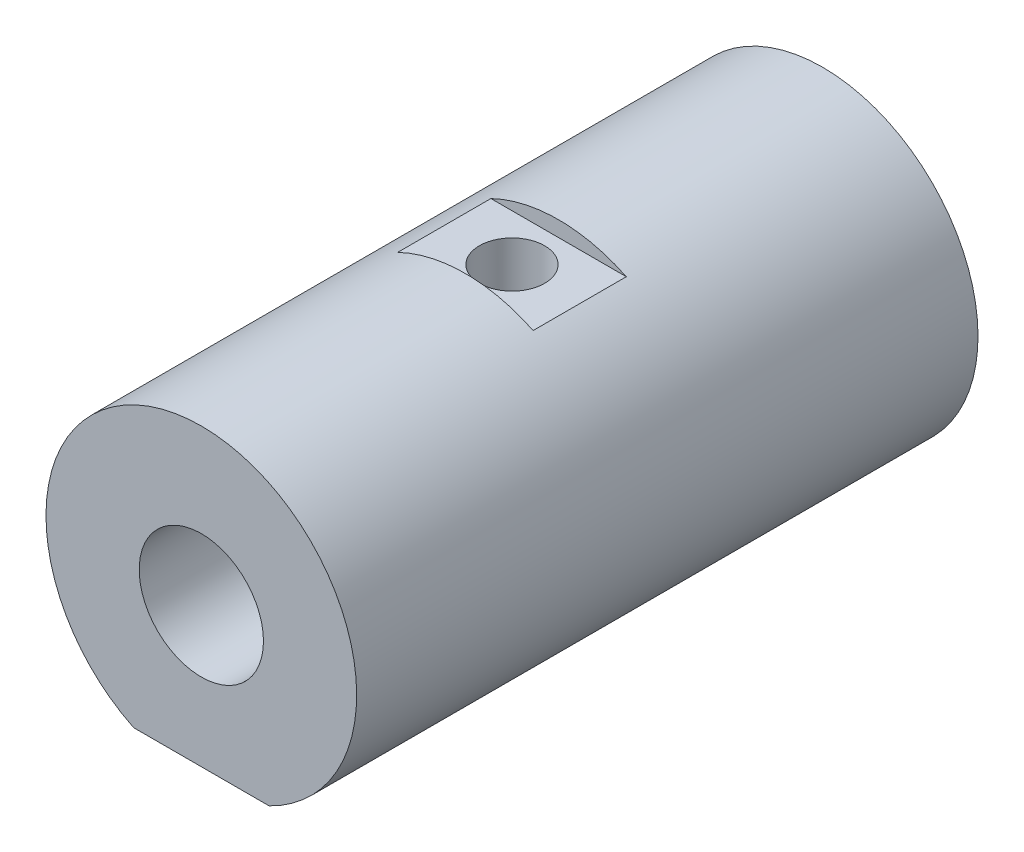
ISO-10303-21;
HEADER;
FILE_DESCRIPTION(('STEP AP214'),'2;1');
FILE_NAME('part.step','',(''),(''),'','','');
FILE_SCHEMA(('AUTOMOTIVE_DESIGN { 1 0 10303 214 1 1 1 1 }'));
ENDSEC;
DATA;
#1=APPLICATION_CONTEXT('core data for automotive mechanical design processes');
#2=APPLICATION_PROTOCOL_DEFINITION('international standard','automotive_design',2000,#1);
#3=PRODUCT_CONTEXT('',#1,'mechanical');
#4=PRODUCT('Part','Part','',(#3));
#5=PRODUCT_RELATED_PRODUCT_CATEGORY('part','',(#4));
#6=PRODUCT_DEFINITION_FORMATION('','',#4);
#7=PRODUCT_DEFINITION_CONTEXT('part definition',#1,'design');
#8=PRODUCT_DEFINITION('design','',#6,#7);
#9=PRODUCT_DEFINITION_SHAPE('','',#8);
#10=(LENGTH_UNIT() NAMED_UNIT(*) SI_UNIT(.MILLI.,.METRE.));
#11=(NAMED_UNIT(*) PLANE_ANGLE_UNIT() SI_UNIT($,.RADIAN.));
#12=(NAMED_UNIT(*) SI_UNIT($,.STERADIAN.) SOLID_ANGLE_UNIT());
#13=UNCERTAINTY_MEASURE_WITH_UNIT(LENGTH_MEASURE(1.E-05),#10,'distance_accuracy_value','');
#14=(GEOMETRIC_REPRESENTATION_CONTEXT(3) GLOBAL_UNCERTAINTY_ASSIGNED_CONTEXT((#13)) GLOBAL_UNIT_ASSIGNED_CONTEXT((#10,
#11,#12)) REPRESENTATION_CONTEXT('',''));
#15=CARTESIAN_POINT('',(0.,0.,0.));
#16=DIRECTION('',(0.,0.,1.));
#17=DIRECTION('',(1.,0.,0.));
#18=AXIS2_PLACEMENT_3D('',#15,#16,#17);
#19=CARTESIAN_POINT('',(0.,0.,40.));
#20=DIRECTION('',(0.,0.,1.));
#21=DIRECTION('',(1.,0.,0.));
#22=AXIS2_PLACEMENT_3D('',#19,#20,#21);
#23=PLANE('',#22);
#24=DIRECTION('',(1.,0.,0.));
#25=VECTOR('',#24,1.);
#26=CARTESIAN_POINT('',(-10.,-9.,40.));
#27=LINE('',#26,#25);
#28=CARTESIAN_POINT('',(-4.35889894354067,-9.,40.));
#29=VERTEX_POINT('',#28);
#30=CARTESIAN_POINT('',(4.35889894354067,-9.,40.));
#31=VERTEX_POINT('',#30);
#32=EDGE_CURVE('E49',#29,#31,#27,.T.);
#33=ORIENTED_EDGE('',*,*,#32,.T.);
#34=CARTESIAN_POINT('',(0.,0.,40.));
#35=DIRECTION('',(0.,0.,1.));
#36=DIRECTION('',(1.,0.,0.));
#37=AXIS2_PLACEMENT_3D('',#34,#35,#36);
#38=CIRCLE('',#37,10.);
#39=EDGE_CURVE('E87',#31,#29,#38,.T.);
#40=ORIENTED_EDGE('',*,*,#39,.T.);
#41=EDGE_LOOP('',(#33,#40));
#42=FACE_BOUND('',#41,.T.);
#43=CARTESIAN_POINT('',(0.,0.,40.));
#44=DIRECTION('',(0.,0.,1.));
#45=DIRECTION('',(1.,0.,0.));
#46=AXIS2_PLACEMENT_3D('',#43,#44,#45);
#47=CIRCLE('',#46,4.);
#48=CARTESIAN_POINT('',(4.,0.,40.));
#49=VERTEX_POINT('',#48);
#50=EDGE_CURVE('E93',#49,#49,#47,.T.);
#51=ORIENTED_EDGE('',*,*,#50,.F.);
#52=EDGE_LOOP('',(#51));
#53=FACE_BOUND('',#52,.T.);
#54=ADVANCED_FACE('F33',(#42,#53),#23,.T.);
#55=CARTESIAN_POINT('',(0.,0.,0.));
#56=DIRECTION('',(0.,0.,1.));
#57=DIRECTION('',(1.,0.,0.));
#58=AXIS2_PLACEMENT_3D('',#55,#56,#57);
#59=PLANE('',#58);
#60=CARTESIAN_POINT('',(0.,0.,0.));
#61=DIRECTION('',(0.,0.,1.));
#62=DIRECTION('',(1.,0.,0.));
#63=AXIS2_PLACEMENT_3D('',#60,#61,#62);
#64=CIRCLE('',#63,10.);
#65=CARTESIAN_POINT('',(4.35889894354067,-9.,0.));
#66=VERTEX_POINT('',#65);
#67=CARTESIAN_POINT('',(-4.35889894354067,-9.,0.));
#68=VERTEX_POINT('',#67);
#69=EDGE_CURVE('E89',#66,#68,#64,.T.);
#70=ORIENTED_EDGE('',*,*,#69,.F.);
#71=DIRECTION('',(-1.,0.,0.));
#72=VECTOR('',#71,1.);
#73=CARTESIAN_POINT('',(10.,-9.,0.));
#74=LINE('',#73,#72);
#75=EDGE_CURVE('E76',#66,#68,#74,.T.);
#76=ORIENTED_EDGE('',*,*,#75,.T.);
#77=EDGE_LOOP('',(#70,#76));
#78=FACE_BOUND('',#77,.T.);
#79=CARTESIAN_POINT('',(0.,0.,0.));
#80=DIRECTION('',(0.,0.,1.));
#81=DIRECTION('',(1.,0.,0.));
#82=AXIS2_PLACEMENT_3D('',#79,#80,#81);
#83=CIRCLE('',#82,4.);
#84=CARTESIAN_POINT('',(4.,0.,0.));
#85=VERTEX_POINT('',#84);
#86=EDGE_CURVE('E96',#85,#85,#83,.T.);
#87=ORIENTED_EDGE('',*,*,#86,.T.);
#88=EDGE_LOOP('',(#87));
#89=FACE_BOUND('',#88,.T.);
#90=ADVANCED_FACE('F179',(#78,#89),#59,.F.);
#91=CARTESIAN_POINT('',(0.,0.,40.));
#92=DIRECTION('',(0.,0.,-1.));
#93=DIRECTION('',(-1.,0.,0.));
#94=AXIS2_PLACEMENT_3D('',#91,#92,#93);
#95=CYLINDRICAL_SURFACE('',#94,10.);
#96=CARTESIAN_POINT('',(0.,0.,23.));
#97=DIRECTION('',(0.,0.,1.));
#98=DIRECTION('',(1.,0.,0.));
#99=AXIS2_PLACEMENT_3D('',#96,#97,#98);
#100=CIRCLE('',#99,10.);
#101=CARTESIAN_POINT('',(4.35889894354067,9.,23.));
#102=VERTEX_POINT('',#101);
#103=CARTESIAN_POINT('',(-4.35889894354067,9.,23.));
#104=VERTEX_POINT('',#103);
#105=EDGE_CURVE('E11',#102,#104,#100,.T.);
#106=ORIENTED_EDGE('',*,*,#105,.T.);
#107=DIRECTION('',(0.,0.,-1.));
#108=VECTOR('',#107,1.);
#109=CARTESIAN_POINT('',(-4.35889894354067,9.,40.));
#110=LINE('',#109,#108);
#111=CARTESIAN_POINT('',(-4.35889894354067,9.,17.));
#112=VERTEX_POINT('',#111);
#113=EDGE_CURVE('E105',#104,#112,#110,.T.);
#114=ORIENTED_EDGE('',*,*,#113,.T.);
#115=CARTESIAN_POINT('',(0.,0.,17.));
#116=DIRECTION('',(0.,0.,-1.));
#117=DIRECTION('',(-1.,0.,0.));
#118=AXIS2_PLACEMENT_3D('',#115,#116,#117);
#119=CIRCLE('',#118,10.);
#120=CARTESIAN_POINT('',(4.35889894354067,9.,17.));
#121=VERTEX_POINT('',#120);
#122=EDGE_CURVE('E42',#112,#121,#119,.T.);
#123=ORIENTED_EDGE('',*,*,#122,.T.);
#124=DIRECTION('',(0.,0.,-1.));
#125=VECTOR('',#124,1.);
#126=CARTESIAN_POINT('',(4.35889894354067,9.,40.));
#127=LINE('',#126,#125);
#128=EDGE_CURVE('E101',#121,#102,#127,.F.);
#129=ORIENTED_EDGE('',*,*,#128,.T.);
#130=EDGE_LOOP('',(#106,#114,#123,#129));
#131=FACE_BOUND('',#130,.T.);
#132=ORIENTED_EDGE('',*,*,#39,.F.);
#133=DIRECTION('',(0.,0.,-1.));
#134=VECTOR('',#133,1.);
#135=CARTESIAN_POINT('',(4.35889894354067,-9.,40.));
#136=LINE('',#135,#134);
#137=EDGE_CURVE('E73',#31,#66,#136,.T.);
#138=ORIENTED_EDGE('',*,*,#137,.T.);
#139=ORIENTED_EDGE('',*,*,#69,.T.);
#140=DIRECTION('',(0.,0.,-1.));
#141=VECTOR('',#140,1.);
#142=CARTESIAN_POINT('',(-4.35889894354067,-9.,40.));
#143=LINE('',#142,#141);
#144=EDGE_CURVE('E82',#68,#29,#143,.F.);
#145=ORIENTED_EDGE('',*,*,#144,.T.);
#146=EDGE_LOOP('',(#132,#138,#139,#145));
#147=FACE_BOUND('',#146,.T.);
#148=ADVANCED_FACE('F35',(#131,#147),#95,.T.);
#149=CARTESIAN_POINT('',(0.,0.,40.));
#150=DIRECTION('',(0.,0.,-1.));
#151=DIRECTION('',(-1.,0.,0.));
#152=AXIS2_PLACEMENT_3D('',#149,#150,#151);
#153=CYLINDRICAL_SURFACE('',#152,4.);
#154=CARTESIAN_POINT('',(0.,-4.,22.1));
#155=CARTESIAN_POINT('',(0.109725239522176,-3.99999264287857,22.099991491824));
#156=CARTESIAN_POINT('',(0.219566121797986,-3.99543735627817,22.0913492221785));
#157=CARTESIAN_POINT('',(0.435956332853303,-3.97766056559727,22.0571794851637));
#158=CARTESIAN_POINT('',(0.54249996702617,-3.96442485872988,22.0316243445559));
#159=CARTESIAN_POINT('',(0.748847767256637,-3.93066356262107,21.96492682042));
#160=CARTESIAN_POINT('',(0.84867708849202,-3.91016722161181,21.9238469319648));
#161=CARTESIAN_POINT('',(1.0398542926017,-3.86372814833453,21.82761268027));
#162=CARTESIAN_POINT('',(1.13120230734359,-3.83778550076629,21.7724585359073));
#163=CARTESIAN_POINT('',(1.30947182891695,-3.78081963010103,21.64560480379));
#164=CARTESIAN_POINT('',(1.39572427915895,-3.7495762633363,21.5730654494358));
#165=CARTESIAN_POINT('',(1.55546505007128,-3.68618069665244,21.4153256839063));
#166=CARTESIAN_POINT('',(1.62894256542358,-3.65402775386038,21.3301146666852));
#167=CARTESIAN_POINT('',(1.76753210720387,-3.58917602274785,21.1405241641815));
#168=CARTESIAN_POINT('',(1.83134596949796,-3.55667651133238,21.0351191113742));
#169=CARTESIAN_POINT('',(1.94007800952201,-3.49855992208216,20.8132210125949));
#170=CARTESIAN_POINT('',(1.98501055983617,-3.47293761465965,20.6967364835342));
#171=CARTESIAN_POINT('',(2.05162778973323,-3.43398312295476,20.4632691019904));
#172=CARTESIAN_POINT('',(2.07458133375183,-3.41998733122417,20.346765095698));
#173=CARTESIAN_POINT('',(2.1004206577409,-3.40418721984817,20.1107919613446));
#174=CARTESIAN_POINT('',(2.10333025607272,-3.40236843025801,19.9913265219365));
#175=CARTESIAN_POINT('',(2.08992575686748,-3.41060563138389,19.770235859006));
#176=CARTESIAN_POINT('',(2.07615752002026,-3.4190893964975,19.6683823531537));
#177=CARTESIAN_POINT('',(2.03424482005422,-3.44418916575293,19.4687198513604));
#178=CARTESIAN_POINT('',(2.00609491145432,-3.460808250155,19.3709124025946));
#179=CARTESIAN_POINT('',(1.93576201725035,-3.50064017337879,19.1793394413355));
#180=CARTESIAN_POINT('',(1.89327386515966,-3.52399463994301,19.0857168263886));
#181=CARTESIAN_POINT('',(1.79571666755297,-3.57469177714186,18.9064612544599));
#182=CARTESIAN_POINT('',(1.74064200304353,-3.60203622704668,18.820831890023));
#183=CARTESIAN_POINT('',(1.61039398180522,-3.66230444404028,18.6472195775902));
#184=CARTESIAN_POINT('',(1.53347842501707,-3.69546972830905,18.5606227305343));
#185=CARTESIAN_POINT('',(1.36616462781175,-3.76053926987168,18.4009450794933));
#186=CARTESIAN_POINT('',(1.27575868558247,-3.79244279356363,18.3278720501457));
#187=CARTESIAN_POINT('',(1.07766804032998,-3.85356353260701,18.1934178793153));
#188=CARTESIAN_POINT('',(0.9692989194435,-3.88252998474475,18.1329215311883));
#189=CARTESIAN_POINT('',(0.742023442184863,-3.93228772595726,18.031537329285));
#190=CARTESIAN_POINT('',(0.623126340783868,-3.95308610970455,17.9906324518135));
#191=CARTESIAN_POINT('',(0.38939697462669,-3.9825873442618,17.9332273208939));
#192=CARTESIAN_POINT('',(0.275130823094224,-3.99219507728301,17.9148930907168));
#193=CARTESIAN_POINT('',(0.0447608666750931,-4.00140669767392,17.8973068509909));
#194=CARTESIAN_POINT('',(-0.0713418920739016,-4.00101608864393,17.8980443433899));
#195=CARTESIAN_POINT('',(-0.291279078552977,-3.99076728683619,17.9176272578829));
#196=CARTESIAN_POINT('',(-0.395299675486035,-3.98173859499713,17.9348862295497));
#197=CARTESIAN_POINT('',(-0.59872818219623,-3.95626547527309,17.9844387504391));
#198=CARTESIAN_POINT('',(-0.69813560404272,-3.93982026491349,18.0167338860534));
#199=CARTESIAN_POINT('',(-0.892553327327725,-3.90044221082327,18.0961442538187));
#200=CARTESIAN_POINT('',(-0.987382033379109,-3.87735176388228,18.1436230742673));
#201=CARTESIAN_POINT('',(-1.16801156602731,-3.82682103032807,18.2516191750348));
#202=CARTESIAN_POINT('',(-1.25380875133066,-3.79937900035166,18.312141684517));
#203=CARTESIAN_POINT('',(-1.42355402164766,-3.73930849945052,18.4518345538914));
#204=CARTESIAN_POINT('',(-1.50635375236175,-3.70643824529688,18.5322981388151));
#205=CARTESIAN_POINT('',(-1.65784945462857,-3.64120206418591,18.7058513788572));
#206=CARTESIAN_POINT('',(-1.72653319455466,-3.60883659688132,18.798951868959));
#207=CARTESIAN_POINT('',(-1.85197407713203,-3.54618291275876,19.0023355901591));
#208=CARTESIAN_POINT('',(-1.90772058421701,-3.51615003477916,19.1133282356271));
#209=CARTESIAN_POINT('',(-1.99916377433976,-3.46498558301669,19.3451612259643));
#210=CARTESIAN_POINT('',(-2.03488847416355,-3.44384158132139,19.4659875377611));
#211=CARTESIAN_POINT('',(-2.0817922879402,-3.41567335738197,19.7014904952612));
#212=CARTESIAN_POINT('',(-2.09503212797939,-3.40746939702879,19.8156110312326));
#213=CARTESIAN_POINT('',(-2.10264402498695,-3.40278132518373,20.0446930844381));
#214=CARTESIAN_POINT('',(-2.09702755352026,-3.40629008804561,20.1596540479175));
#215=CARTESIAN_POINT('',(-2.06905731966412,-3.42333280060867,20.3731696143222));
#216=CARTESIAN_POINT('',(-2.04869586578454,-3.4356715106149,20.4720943355128));
#217=CARTESIAN_POINT('',(-1.99445953447469,-3.46743607984359,20.6649608140123));
#218=CARTESIAN_POINT('',(-1.96057985676337,-3.48686445637591,20.7589007878124));
#219=CARTESIAN_POINT('',(-1.87782708009151,-3.53215539501753,20.945996601257));
#220=CARTESIAN_POINT('',(-1.82811697206111,-3.55835615136984,21.0386976915773));
#221=CARTESIAN_POINT('',(-1.71597189148522,-3.61377283019222,21.2150623092182));
#222=CARTESIAN_POINT('',(-1.65353007488423,-3.64299037017672,21.2987209385083));
#223=CARTESIAN_POINT('',(-1.50756499361578,-3.70599460661239,21.4667236471341));
#224=CARTESIAN_POINT('',(-1.42231898680452,-3.73985298438168,21.5495535097663));
#225=CARTESIAN_POINT('',(-1.2383912708079,-3.80472261290781,21.7001573919456));
#226=CARTESIAN_POINT('',(-1.13970134446325,-3.83573210281286,21.7679221362338));
#227=CARTESIAN_POINT('',(-0.928722586410796,-3.89224463430732,21.8874336490412));
#228=CARTESIAN_POINT('',(-0.816206474636307,-3.91762876470985,21.9388430106064));
#229=CARTESIAN_POINT('',(-0.641101799511681,-3.94873745727715,22.0007079131557));
#230=CARTESIAN_POINT('',(-0.581718321049476,-3.95794212176884,22.0187813569888));
#231=CARTESIAN_POINT('',(-0.461272845180566,-3.97377707651405,22.0496543911268));
#232=CARTESIAN_POINT('',(-0.400211824286289,-3.98040883184999,22.0624569830487));
#233=CARTESIAN_POINT('',(-0.282777177199969,-3.99038534961525,22.0816425107655));
#234=CARTESIAN_POINT('',(-0.226504746010374,-3.99398117175069,22.0885171091118));
#235=CARTESIAN_POINT('',(-0.113498532604899,-3.99879042332403,22.097698099257));
#236=CARTESIAN_POINT('',(-0.0567647413745311,-4.00000380609873,22.1000044015799));
#237=CARTESIAN_POINT('',(0.,-4.,22.1));
#238=B_SPLINE_CURVE_WITH_KNOTS('',3,(#154,#155,#156,#157,#158,#159,#160,#161,#162,#163,#164,
#165,#166,#167,#168,#169,#170,#171,#172,#173,#174,#175,#176,#177,#178,#179,#180,#181,#182,#183,
#184,#185,#186,#187,#188,#189,#190,#191,#192,#193,#194,#195,#196,#197,#198,#199,#200,#201,#202,
#203,#204,#205,#206,#207,#208,#209,#210,#211,#212,#213,#214,#215,#216,#217,#218,#219,#220,#221,
#222,#223,#224,#225,#226,#227,#228,#229,#230,#231,#232,#233,#234,#235,#236,#237),.UNSPECIFIED.,
.T.,.F.,(4,2,2,2,2,2,2,2,2,2,2,2,2,2,2,2,2,2,2,2,2,2,2,2,2,2,2,2,2,2,2,2,2,2,2,2,2,2,2,2,2,4),
(0.,0.328955388056858,0.658450355809533,0.986632826787796,1.31481019432105,1.66422610127769,
2.01393612903032,2.39430542275381,2.77438464995629,3.13089429519635,3.48698022433372,
3.79492330354659,4.10298306894291,4.41806287071791,4.73328360921356,5.0931748825876,
5.4532724136417,5.83355153918037,6.21349962504739,6.55994297045684,6.90619561978194,
7.22222027001751,7.53827827001648,7.86255611827312,8.18696421086294,8.54557019619715,
8.90448561862086,9.28577946390601,9.66653841880978,10.0100186118085,10.3532898805348,
10.6572136356427,10.9612454093544,11.2851996834104,11.6093285635883,11.9784125341219,
12.3477231159961,12.7242211787441,12.9122308814787,13.1001333688401,13.270310275105,
13.4404905144749),.UNSPECIFIED.);
#239=CARTESIAN_POINT('',(0.,-4.,22.1));
#240=VERTEX_POINT('',#239);
#241=EDGE_CURVE('E81',#240,#240,#238,.T.);
#242=ORIENTED_EDGE('',*,*,#241,.F.);
#243=EDGE_LOOP('',(#242));
#244=FACE_BOUND('',#243,.T.);
#245=CARTESIAN_POINT('',(0.,-4.,12.1));
#246=CARTESIAN_POINT('',(0.109725239522177,-3.99999264287857,12.099991491824));
#247=CARTESIAN_POINT('',(0.219566121797987,-3.99543735627817,12.0913492221785));
#248=CARTESIAN_POINT('',(0.435956332853304,-3.97766056559727,12.0571794851637));
#249=CARTESIAN_POINT('',(0.542499967026172,-3.96442485872988,12.0316243445559));
#250=CARTESIAN_POINT('',(0.748847767256639,-3.93066356262107,11.96492682042));
#251=CARTESIAN_POINT('',(0.848677088492022,-3.91016722161181,11.9238469319648));
#252=CARTESIAN_POINT('',(1.0398542926017,-3.86372814833453,11.82761268027));
#253=CARTESIAN_POINT('',(1.13120230734359,-3.83778550076629,11.7724585359073));
#254=CARTESIAN_POINT('',(1.30947182891695,-3.78081963010103,11.64560480379));
#255=CARTESIAN_POINT('',(1.39572427915896,-3.7495762633363,11.5730654494358));
#256=CARTESIAN_POINT('',(1.55546505007129,-3.68618069665244,11.4153256839063));
#257=CARTESIAN_POINT('',(1.62894256542359,-3.65402775386038,11.3301146666852));
#258=CARTESIAN_POINT('',(1.76753210720387,-3.58917602274785,11.1405241641815));
#259=CARTESIAN_POINT('',(1.83134596949796,-3.55667651133238,11.0351191113742));
#260=CARTESIAN_POINT('',(1.94007800952201,-3.49855992208216,10.8132210125949));
#261=CARTESIAN_POINT('',(1.98501055983617,-3.47293761465965,10.6967364835342));
#262=CARTESIAN_POINT('',(2.05162778973323,-3.43398312295476,10.4632691019904));
#263=CARTESIAN_POINT('',(2.07458133375183,-3.41998733122417,10.346765095698));
#264=CARTESIAN_POINT('',(2.1004206577409,-3.40418721984817,10.1107919613446));
#265=CARTESIAN_POINT('',(2.10333025607272,-3.40236843025801,9.99132652193647));
#266=CARTESIAN_POINT('',(2.08992575686748,-3.41060563138389,9.77023585900601));
#267=CARTESIAN_POINT('',(2.07615752002026,-3.41908939649749,9.66838235315366));
#268=CARTESIAN_POINT('',(2.03424482005422,-3.44418916575293,9.46871985136041));
#269=CARTESIAN_POINT('',(2.00609491145432,-3.460808250155,9.37091240259461));
#270=CARTESIAN_POINT('',(1.93576201725035,-3.50064017337879,9.17933944133553));
#271=CARTESIAN_POINT('',(1.89327386515966,-3.523994639943,9.08571682638858));
#272=CARTESIAN_POINT('',(1.79571666755297,-3.57469177714186,8.90646125445991));
#273=CARTESIAN_POINT('',(1.74064200304353,-3.60203622704668,8.82083189002303));
#274=CARTESIAN_POINT('',(1.61039398180522,-3.66230444404028,8.64721957759017));
#275=CARTESIAN_POINT('',(1.53347842501707,-3.69546972830905,8.5606227305343));
#276=CARTESIAN_POINT('',(1.36616462781176,-3.76053926987168,8.40094507949334));
#277=CARTESIAN_POINT('',(1.27575868558247,-3.79244279356364,8.32787205014572));
#278=CARTESIAN_POINT('',(1.07766804032998,-3.85356353260701,8.19341787931535));
#279=CARTESIAN_POINT('',(0.969298919443502,-3.88252998474475,8.13292153118831));
#280=CARTESIAN_POINT('',(0.742023442184864,-3.93228772595726,8.031537329285));
#281=CARTESIAN_POINT('',(0.623126340783869,-3.95308610970455,7.99063245181349));
#282=CARTESIAN_POINT('',(0.389396974626691,-3.9825873442618,7.93322732089386));
#283=CARTESIAN_POINT('',(0.275130823094225,-3.99219507728301,7.9148930907168));
#284=CARTESIAN_POINT('',(0.0447608666750947,-4.00140669767392,7.89730685099086));
#285=CARTESIAN_POINT('',(-0.0713418920738997,-4.00101608864393,7.89804434338993));
#286=CARTESIAN_POINT('',(-0.291279078552975,-3.99076728683619,7.91762725788288));
#287=CARTESIAN_POINT('',(-0.395299675486032,-3.98173859499713,7.93488622954968));
#288=CARTESIAN_POINT('',(-0.598728182196228,-3.95626547527309,7.98443875043909));
#289=CARTESIAN_POINT('',(-0.698135604042719,-3.93982026491349,8.01673388605335));
#290=CARTESIAN_POINT('',(-0.892553327327724,-3.90044221082327,8.09614425381873));
#291=CARTESIAN_POINT('',(-0.987382033379108,-3.87735176388228,8.14362307426731));
#292=CARTESIAN_POINT('',(-1.16801156602731,-3.82682103032807,8.25161917503483));
#293=CARTESIAN_POINT('',(-1.25380875133066,-3.79937900035166,8.312141684517));
#294=CARTESIAN_POINT('',(-1.42355402164766,-3.73930849945052,8.45183455389137));
#295=CARTESIAN_POINT('',(-1.50635375236175,-3.70643824529688,8.53229813881506));
#296=CARTESIAN_POINT('',(-1.65784945462857,-3.64120206418591,8.70585137885724));
#297=CARTESIAN_POINT('',(-1.72653319455466,-3.60883659688132,8.79895186895899));
#298=CARTESIAN_POINT('',(-1.85197407713203,-3.54618291275876,9.00233559015911));
#299=CARTESIAN_POINT('',(-1.907720584217,-3.51615003477916,9.1133282356271));
#300=CARTESIAN_POINT('',(-1.99916377433976,-3.46498558301669,9.34516122596433));
#301=CARTESIAN_POINT('',(-2.03488847416354,-3.44384158132139,9.46598753776113));
#302=CARTESIAN_POINT('',(-2.0817922879402,-3.41567335738197,9.70149049526115));
#303=CARTESIAN_POINT('',(-2.09503212797939,-3.40746939702879,9.81561103123257));
#304=CARTESIAN_POINT('',(-2.10264402498695,-3.40278132518373,10.0446930844381));
#305=CARTESIAN_POINT('',(-2.09702755352026,-3.40629008804561,10.1596540479175));
#306=CARTESIAN_POINT('',(-2.06905731966412,-3.42333280060867,10.3731696143222));
#307=CARTESIAN_POINT('',(-2.04869586578454,-3.4356715106149,10.4720943355129));
#308=CARTESIAN_POINT('',(-1.99445953447468,-3.4674360798436,10.6649608140123));
#309=CARTESIAN_POINT('',(-1.96057985676337,-3.48686445637591,10.7589007878124));
#310=CARTESIAN_POINT('',(-1.87782708009151,-3.53215539501753,10.945996601257));
#311=CARTESIAN_POINT('',(-1.82811697206111,-3.55835615136984,11.0386976915773));
#312=CARTESIAN_POINT('',(-1.71597189148522,-3.61377283019222,11.2150623092182));
#313=CARTESIAN_POINT('',(-1.65353007488422,-3.64299037017672,11.2987209385083));
#314=CARTESIAN_POINT('',(-1.50756499361577,-3.7059946066124,11.4667236471341));
#315=CARTESIAN_POINT('',(-1.42231898680452,-3.73985298438168,11.5495535097663));
#316=CARTESIAN_POINT('',(-1.2383912708079,-3.80472261290781,11.7001573919456));
#317=CARTESIAN_POINT('',(-1.13970134446325,-3.83573210281286,11.7679221362338));
#318=CARTESIAN_POINT('',(-0.928722586410791,-3.89224463430732,11.8874336490412));
#319=CARTESIAN_POINT('',(-0.816206474636304,-3.91762876470986,11.9388430106064));
#320=CARTESIAN_POINT('',(-0.641101799511679,-3.94873745727715,12.0007079131557));
#321=CARTESIAN_POINT('',(-0.581718321049472,-3.95794212176884,12.0187813569888));
#322=CARTESIAN_POINT('',(-0.461272845180562,-3.97377707651405,12.0496543911268));
#323=CARTESIAN_POINT('',(-0.400211824286286,-3.98040883184999,12.0624569830487));
#324=CARTESIAN_POINT('',(-0.282777177199967,-3.99038534961525,12.0816425107655));
#325=CARTESIAN_POINT('',(-0.226504746010372,-3.99398117175069,12.0885171091118));
#326=CARTESIAN_POINT('',(-0.113498532604897,-3.99879042332403,12.097698099257));
#327=CARTESIAN_POINT('',(-0.0567647413745295,-4.00000380609873,12.1000044015799));
#328=CARTESIAN_POINT('',(0.,-4.,12.1));
#329=B_SPLINE_CURVE_WITH_KNOTS('',3,(#245,#246,#247,#248,#249,#250,#251,#252,#253,#254,#255,
#256,#257,#258,#259,#260,#261,#262,#263,#264,#265,#266,#267,#268,#269,#270,#271,#272,#273,#274,
#275,#276,#277,#278,#279,#280,#281,#282,#283,#284,#285,#286,#287,#288,#289,#290,#291,#292,#293,
#294,#295,#296,#297,#298,#299,#300,#301,#302,#303,#304,#305,#306,#307,#308,#309,#310,#311,#312,
#313,#314,#315,#316,#317,#318,#319,#320,#321,#322,#323,#324,#325,#326,#327,#328),.UNSPECIFIED.,
.T.,.F.,(4,2,2,2,2,2,2,2,2,2,2,2,2,2,2,2,2,2,2,2,2,2,2,2,2,2,2,2,2,2,2,2,2,2,2,2,2,2,2,2,2,4),
(0.,0.328955388056857,0.658450355809534,0.986632826787797,1.31481019432105,1.66422610127769,
2.01393612903032,2.3943054227538,2.77438464995628,3.13089429519635,3.48698022433372,
3.79492330354659,4.10298306894291,4.41806287071792,4.73328360921356,5.0931748825876,
5.4532724136417,5.83355153918036,6.21349962504739,6.55994297045684,6.90619561978194,
7.22222027001751,7.53827827001648,7.86255611827312,8.18696421086294,8.54557019619715,
8.90448561862086,9.28577946390601,9.66653841880978,10.0100186118085,10.3532898805348,
10.6572136356427,10.9612454093544,11.2851996834104,11.6093285635883,11.9784125341219,
12.3477231159961,12.7242211787441,12.9122308814787,13.1001333688401,13.270310275105,
13.4404905144749),.UNSPECIFIED.);
#330=CARTESIAN_POINT('',(0.,-4.,12.1));
#331=VERTEX_POINT('',#330);
#332=EDGE_CURVE('E155',#331,#331,#329,.T.);
#333=ORIENTED_EDGE('',*,*,#332,.F.);
#334=EDGE_LOOP('',(#333));
#335=FACE_BOUND('',#334,.T.);
#336=CARTESIAN_POINT('',(0.,-4.,32.1));
#337=CARTESIAN_POINT('',(0.10972523952218,-3.99999264287857,32.099991491824));
#338=CARTESIAN_POINT('',(0.21956612179799,-3.99543735627817,32.0913492221785));
#339=CARTESIAN_POINT('',(0.435956332853307,-3.97766056559727,32.0571794851637));
#340=CARTESIAN_POINT('',(0.542499967026175,-3.96442485872988,32.0316243445559));
#341=CARTESIAN_POINT('',(0.748847767256642,-3.93066356262107,31.96492682042));
#342=CARTESIAN_POINT('',(0.848677088492025,-3.91016722161181,31.9238469319648));
#343=CARTESIAN_POINT('',(1.03985429260171,-3.86372814833453,31.82761268027));
#344=CARTESIAN_POINT('',(1.13120230734359,-3.83778550076629,31.7724585359073));
#345=CARTESIAN_POINT('',(1.30947182891695,-3.78081963010103,31.64560480379));
#346=CARTESIAN_POINT('',(1.39572427915896,-3.74957626333629,31.5730654494358));
#347=CARTESIAN_POINT('',(1.55546505007129,-3.68618069665244,31.4153256839063));
#348=CARTESIAN_POINT('',(1.62894256542359,-3.65402775386038,31.3301146666852));
#349=CARTESIAN_POINT('',(1.76753210720387,-3.58917602274785,31.1405241641815));
#350=CARTESIAN_POINT('',(1.83134596949796,-3.55667651133238,31.0351191113742));
#351=CARTESIAN_POINT('',(1.94007800952201,-3.49855992208215,30.8132210125949));
#352=CARTESIAN_POINT('',(1.98501055983618,-3.47293761465965,30.6967364835342));
#353=CARTESIAN_POINT('',(2.05162778973323,-3.43398312295476,30.4632691019904));
#354=CARTESIAN_POINT('',(2.07458133375183,-3.41998733122416,30.346765095698));
#355=CARTESIAN_POINT('',(2.1004206577409,-3.40418721984817,30.1107919613446));
#356=CARTESIAN_POINT('',(2.10333025607272,-3.40236843025801,29.9913265219365));
#357=CARTESIAN_POINT('',(2.08992575686748,-3.41060563138388,29.770235859006));
#358=CARTESIAN_POINT('',(2.07615752002026,-3.41908939649749,29.6683823531537));
#359=CARTESIAN_POINT('',(2.03424482005423,-3.44418916575293,29.4687198513604));
#360=CARTESIAN_POINT('',(2.00609491145432,-3.460808250155,29.3709124025946));
#361=CARTESIAN_POINT('',(1.93576201725035,-3.50064017337878,29.1793394413355));
#362=CARTESIAN_POINT('',(1.89327386515967,-3.523994639943,29.0857168263886));
#363=CARTESIAN_POINT('',(1.79571666755297,-3.57469177714185,28.9064612544599));
#364=CARTESIAN_POINT('',(1.74064200304353,-3.60203622704667,28.820831890023));
#365=CARTESIAN_POINT('',(1.61039398180522,-3.66230444404028,28.6472195775902));
#366=CARTESIAN_POINT('',(1.53347842501707,-3.69546972830905,28.5606227305343));
#367=CARTESIAN_POINT('',(1.36616462781176,-3.76053926987167,28.4009450794933));
#368=CARTESIAN_POINT('',(1.27575868558248,-3.79244279356363,28.3278720501457));
#369=CARTESIAN_POINT('',(1.07766804032999,-3.85356353260701,28.1934178793153));
#370=CARTESIAN_POINT('',(0.969298919443505,-3.88252998474475,28.1329215311883));
#371=CARTESIAN_POINT('',(0.742023442184868,-3.93228772595726,28.031537329285));
#372=CARTESIAN_POINT('',(0.623126340783873,-3.95308610970455,27.9906324518135));
#373=CARTESIAN_POINT('',(0.389396974626696,-3.9825873442618,27.9332273208939));
#374=CARTESIAN_POINT('',(0.275130823094229,-3.99219507728301,27.9148930907168));
#375=CARTESIAN_POINT('',(0.0447608666750983,-4.00140669767392,27.8973068509909));
#376=CARTESIAN_POINT('',(-0.0713418920738961,-4.00101608864393,27.8980443433899));
#377=CARTESIAN_POINT('',(-0.291279078552971,-3.99076728683619,27.9176272578829));
#378=CARTESIAN_POINT('',(-0.395299675486029,-3.98173859499713,27.9348862295497));
#379=CARTESIAN_POINT('',(-0.598728182196224,-3.95626547527309,27.9844387504391));
#380=CARTESIAN_POINT('',(-0.698135604042716,-3.93982026491349,28.0167338860533));
#381=CARTESIAN_POINT('',(-0.89255332732772,-3.90044221082327,28.0961442538187));
#382=CARTESIAN_POINT('',(-0.987382033379103,-3.87735176388228,28.1436230742673));
#383=CARTESIAN_POINT('',(-1.1680115660273,-3.82682103032807,28.2516191750348));
#384=CARTESIAN_POINT('',(-1.25380875133066,-3.79937900035167,28.312141684517));
#385=CARTESIAN_POINT('',(-1.42355402164765,-3.73930849945052,28.4518345538914));
#386=CARTESIAN_POINT('',(-1.50635375236175,-3.70643824529688,28.5322981388151));
#387=CARTESIAN_POINT('',(-1.65784945462857,-3.64120206418591,28.7058513788572));
#388=CARTESIAN_POINT('',(-1.72653319455466,-3.60883659688132,28.798951868959));
#389=CARTESIAN_POINT('',(-1.85197407713202,-3.54618291275876,29.0023355901591));
#390=CARTESIAN_POINT('',(-1.907720584217,-3.51615003477916,29.1133282356271));
#391=CARTESIAN_POINT('',(-1.99916377433975,-3.46498558301669,29.3451612259643));
#392=CARTESIAN_POINT('',(-2.03488847416354,-3.44384158132139,29.4659875377611));
#393=CARTESIAN_POINT('',(-2.0817922879402,-3.41567335738197,29.7014904952612));
#394=CARTESIAN_POINT('',(-2.09503212797938,-3.40746939702879,29.8156110312326));
#395=CARTESIAN_POINT('',(-2.10264402498695,-3.40278132518373,30.0446930844381));
#396=CARTESIAN_POINT('',(-2.09702755352025,-3.40629008804561,30.1596540479175));
#397=CARTESIAN_POINT('',(-2.06905731966412,-3.42333280060867,30.3731696143222));
#398=CARTESIAN_POINT('',(-2.04869586578454,-3.4356715106149,30.4720943355128));
#399=CARTESIAN_POINT('',(-1.99445953447468,-3.4674360798436,30.6649608140123));
#400=CARTESIAN_POINT('',(-1.96057985676337,-3.48686445637591,30.7589007878124));
#401=CARTESIAN_POINT('',(-1.87782708009151,-3.53215539501753,30.945996601257));
#402=CARTESIAN_POINT('',(-1.82811697206111,-3.55835615136984,31.0386976915773));
#403=CARTESIAN_POINT('',(-1.71597189148522,-3.61377283019222,31.2150623092182));
#404=CARTESIAN_POINT('',(-1.65353007488422,-3.64299037017672,31.2987209385083));
#405=CARTESIAN_POINT('',(-1.50756499361577,-3.7059946066124,31.4667236471341));
#406=CARTESIAN_POINT('',(-1.42231898680452,-3.73985298438168,31.5495535097663));
#407=CARTESIAN_POINT('',(-1.2383912708079,-3.80472261290781,31.7001573919456));
#408=CARTESIAN_POINT('',(-1.13970134446325,-3.83573210281286,31.7679221362338));
#409=CARTESIAN_POINT('',(-0.928722586410793,-3.89224463430732,31.8874336490412));
#410=CARTESIAN_POINT('',(-0.816206474636307,-3.91762876470985,31.9388430106064));
#411=CARTESIAN_POINT('',(-0.64110179951168,-3.94873745727715,32.0007079131557));
#412=CARTESIAN_POINT('',(-0.581718321049472,-3.95794212176884,32.0187813569888));
#413=CARTESIAN_POINT('',(-0.461272845180563,-3.97377707651405,32.0496543911268));
#414=CARTESIAN_POINT('',(-0.400211824286287,-3.98040883184999,32.0624569830487));
#415=CARTESIAN_POINT('',(-0.282777177199968,-3.99038534961525,32.0816425107655));
#416=CARTESIAN_POINT('',(-0.226504746010372,-3.99398117175069,32.0885171091118));
#417=CARTESIAN_POINT('',(-0.113498532604896,-3.99879042332403,32.097698099257));
#418=CARTESIAN_POINT('',(-0.0567647413745276,-4.00000380609873,32.1000044015799));
#419=CARTESIAN_POINT('',(0.,-4.,32.1));
#420=B_SPLINE_CURVE_WITH_KNOTS('',3,(#336,#337,#338,#339,#340,#341,#342,#343,#344,#345,#346,
#347,#348,#349,#350,#351,#352,#353,#354,#355,#356,#357,#358,#359,#360,#361,#362,#363,#364,#365,
#366,#367,#368,#369,#370,#371,#372,#373,#374,#375,#376,#377,#378,#379,#380,#381,#382,#383,#384,
#385,#386,#387,#388,#389,#390,#391,#392,#393,#394,#395,#396,#397,#398,#399,#400,#401,#402,#403,
#404,#405,#406,#407,#408,#409,#410,#411,#412,#413,#414,#415,#416,#417,#418,#419),.UNSPECIFIED.,
.T.,.F.,(4,2,2,2,2,2,2,2,2,2,2,2,2,2,2,2,2,2,2,2,2,2,2,2,2,2,2,2,2,2,2,2,2,2,2,2,2,2,2,2,2,4),
(0.,0.328955388056858,0.658450355809533,0.986632826787796,1.31481019432105,1.6642261012777,
2.01393612903032,2.39430542275381,2.77438464995629,3.13089429519635,3.48698022433372,
3.79492330354659,4.10298306894291,4.41806287071792,4.73328360921356,5.0931748825876,
5.4532724136417,5.83355153918036,6.21349962504739,6.55994297045684,6.90619561978194,
7.22222027001751,7.53827827001648,7.86255611827312,8.18696421086293,8.54557019619715,
8.90448561862086,9.28577946390601,9.66653841880977,10.0100186118085,10.3532898805348,
10.6572136356427,10.9612454093544,11.2851996834104,11.6093285635883,11.9784125341219,
12.347723115996,12.7242211787441,12.9122308814787,13.1001333688401,13.270310275105,
13.4404905144749),.UNSPECIFIED.);
#421=CARTESIAN_POINT('',(0.,-4.,32.1));
#422=VERTEX_POINT('',#421);
#423=EDGE_CURVE('E110',#422,#422,#420,.T.);
#424=ORIENTED_EDGE('',*,*,#423,.F.);
#425=EDGE_LOOP('',(#424));
#426=FACE_BOUND('',#425,.T.);
#427=CARTESIAN_POINT('',(0.,4.,17.9));
#428=CARTESIAN_POINT('',(0.109725239522176,3.99999264287857,17.900008508176));
#429=CARTESIAN_POINT('',(0.219566121797986,3.99543735627817,17.9086507778215));
#430=CARTESIAN_POINT('',(0.435956332853303,3.97766056559727,17.9428205148363));
#431=CARTESIAN_POINT('',(0.54249996702617,3.96442485872988,17.9683756554441));
#432=CARTESIAN_POINT('',(0.748847767256637,3.93066356262107,18.03507317958));
#433=CARTESIAN_POINT('',(0.848677088492021,3.91016722161181,18.0761530680352));
#434=CARTESIAN_POINT('',(1.0398542926017,3.86372814833453,18.17238731973));
#435=CARTESIAN_POINT('',(1.13120230734359,3.83778550076629,18.2275414640927));
#436=CARTESIAN_POINT('',(1.30947182891695,3.78081963010103,18.35439519621));
#437=CARTESIAN_POINT('',(1.39572427915896,3.7495762633363,18.4269345505642));
#438=CARTESIAN_POINT('',(1.55546505007129,3.68618069665244,18.5846743160937));
#439=CARTESIAN_POINT('',(1.62894256542358,3.65402775386038,18.6698853333148));
#440=CARTESIAN_POINT('',(1.76753210720387,3.58917602274785,18.8594758358185));
#441=CARTESIAN_POINT('',(1.83134596949796,3.55667651133238,18.9648808886258));
#442=CARTESIAN_POINT('',(1.94007800952201,3.49855992208216,19.1867789874051));
#443=CARTESIAN_POINT('',(1.98501055983617,3.47293761465965,19.3032635164658));
#444=CARTESIAN_POINT('',(2.05162778973323,3.43398312295476,19.5367308980096));
#445=CARTESIAN_POINT('',(2.07458133375183,3.41998733122416,19.653234904302));
#446=CARTESIAN_POINT('',(2.1004206577409,3.40418721984817,19.8892080386554));
#447=CARTESIAN_POINT('',(2.10333025607272,3.40236843025801,20.0086734780635));
#448=CARTESIAN_POINT('',(2.08992575686748,3.41060563138389,20.229764140994));
#449=CARTESIAN_POINT('',(2.07615752002026,3.4190893964975,20.3316176468463));
#450=CARTESIAN_POINT('',(2.03424482005422,3.44418916575293,20.5312801486396));
#451=CARTESIAN_POINT('',(2.00609491145432,3.460808250155,20.6290875974054));
#452=CARTESIAN_POINT('',(1.93576201725035,3.50064017337879,20.8206605586645));
#453=CARTESIAN_POINT('',(1.89327386515966,3.52399463994301,20.9142831736114));
#454=CARTESIAN_POINT('',(1.79571666755297,3.57469177714186,21.0935387455401));
#455=CARTESIAN_POINT('',(1.74064200304353,3.60203622704668,21.179168109977));
#456=CARTESIAN_POINT('',(1.61039398180522,3.66230444404028,21.3527804224098));
#457=CARTESIAN_POINT('',(1.53347842501707,3.69546972830905,21.4393772694657));
#458=CARTESIAN_POINT('',(1.36616462781175,3.76053926987168,21.5990549205067));
#459=CARTESIAN_POINT('',(1.27575868558247,3.79244279356363,21.6721279498543));
#460=CARTESIAN_POINT('',(1.07766804032998,3.85356353260701,21.8065821206847));
#461=CARTESIAN_POINT('',(0.969298919443501,3.88252998474475,21.8670784688117));
#462=CARTESIAN_POINT('',(0.742023442184863,3.93228772595726,21.968462670715));
#463=CARTESIAN_POINT('',(0.623126340783868,3.95308610970455,22.0093675481865));
#464=CARTESIAN_POINT('',(0.389396974626691,3.9825873442618,22.0667726791061));
#465=CARTESIAN_POINT('',(0.275130823094224,3.99219507728301,22.0851069092832));
#466=CARTESIAN_POINT('',(0.0447608666750929,4.00140669767392,22.1026931490091));
#467=CARTESIAN_POINT('',(-0.0713418920739016,4.00101608864393,22.1019556566101));
#468=CARTESIAN_POINT('',(-0.291279078552977,3.99076728683619,22.0823727421171));
#469=CARTESIAN_POINT('',(-0.395299675486035,3.98173859499713,22.0651137704503));
#470=CARTESIAN_POINT('',(-0.59872818219623,3.95626547527309,22.0155612495609));
#471=CARTESIAN_POINT('',(-0.69813560404272,3.93982026491349,21.9832661139466));
#472=CARTESIAN_POINT('',(-0.892553327327725,3.90044221082327,21.9038557461813));
#473=CARTESIAN_POINT('',(-0.987382033379109,3.87735176388228,21.8563769257327));
#474=CARTESIAN_POINT('',(-1.16801156602731,3.82682103032807,21.7483808249652));
#475=CARTESIAN_POINT('',(-1.25380875133066,3.79937900035166,21.687858315483));
#476=CARTESIAN_POINT('',(-1.42355402164766,3.73930849945052,21.5481654461086));
#477=CARTESIAN_POINT('',(-1.50635375236175,3.70643824529688,21.4677018611849));
#478=CARTESIAN_POINT('',(-1.65784945462857,3.64120206418591,21.2941486211428));
#479=CARTESIAN_POINT('',(-1.72653319455466,3.60883659688132,21.201048131041));
#480=CARTESIAN_POINT('',(-1.85197407713203,3.54618291275876,20.9976644098409));
#481=CARTESIAN_POINT('',(-1.90772058421701,3.51615003477916,20.8866717643729));
#482=CARTESIAN_POINT('',(-1.99916377433976,3.46498558301669,20.6548387740357));
#483=CARTESIAN_POINT('',(-2.03488847416355,3.44384158132139,20.5340124622389));
#484=CARTESIAN_POINT('',(-2.0817922879402,3.41567335738197,20.2985095047388));
#485=CARTESIAN_POINT('',(-2.09503212797939,3.40746939702879,20.1843889687674));
#486=CARTESIAN_POINT('',(-2.10264402498695,3.40278132518373,19.9553069155619));
#487=CARTESIAN_POINT('',(-2.09702755352026,3.40629008804561,19.8403459520825));
#488=CARTESIAN_POINT('',(-2.06905731966412,3.42333280060867,19.6268303856778));
#489=CARTESIAN_POINT('',(-2.04869586578454,3.4356715106149,19.5279056644872));
#490=CARTESIAN_POINT('',(-1.99445953447469,3.46743607984359,19.3350391859877));
#491=CARTESIAN_POINT('',(-1.96057985676337,3.48686445637591,19.2410992121876));
#492=CARTESIAN_POINT('',(-1.87782708009151,3.53215539501753,19.054003398743));
#493=CARTESIAN_POINT('',(-1.82811697206111,3.55835615136983,18.9613023084227));
#494=CARTESIAN_POINT('',(-1.71597189148522,3.61377283019222,18.7849376907818));
#495=CARTESIAN_POINT('',(-1.65353007488423,3.64299037017672,18.7012790614917));
#496=CARTESIAN_POINT('',(-1.50756499361578,3.70599460661239,18.5332763528659));
#497=CARTESIAN_POINT('',(-1.42231898680452,3.73985298438168,18.4504464902337));
#498=CARTESIAN_POINT('',(-1.2383912708079,3.80472261290781,18.2998426080544));
#499=CARTESIAN_POINT('',(-1.13970134446325,3.83573210281286,18.2320778637662));
#500=CARTESIAN_POINT('',(-0.928722586410795,3.89224463430732,18.1125663509588));
#501=CARTESIAN_POINT('',(-0.816206474636306,3.91762876470985,18.0611569893936));
#502=CARTESIAN_POINT('',(-0.64110179951168,3.94873745727715,17.9992920868443));
#503=CARTESIAN_POINT('',(-0.581718321049474,3.95794212176884,17.9812186430112));
#504=CARTESIAN_POINT('',(-0.461272845180564,3.97377707651405,17.9503456088732));
#505=CARTESIAN_POINT('',(-0.400211824286288,3.98040883184999,17.9375430169513));
#506=CARTESIAN_POINT('',(-0.282777177199969,3.99038534961525,17.9183574892345));
#507=CARTESIAN_POINT('',(-0.226504746010374,3.99398117175069,17.9114828908882));
#508=CARTESIAN_POINT('',(-0.113498532604899,3.99879042332403,17.902301900743));
#509=CARTESIAN_POINT('',(-0.0567647413745311,4.00000380609873,17.8999955984201));
#510=CARTESIAN_POINT('',(0.,4.,17.9));
#511=B_SPLINE_CURVE_WITH_KNOTS('',3,(#427,#428,#429,#430,#431,#432,#433,#434,#435,#436,#437,
#438,#439,#440,#441,#442,#443,#444,#445,#446,#447,#448,#449,#450,#451,#452,#453,#454,#455,#456,
#457,#458,#459,#460,#461,#462,#463,#464,#465,#466,#467,#468,#469,#470,#471,#472,#473,#474,#475,
#476,#477,#478,#479,#480,#481,#482,#483,#484,#485,#486,#487,#488,#489,#490,#491,#492,#493,#494,
#495,#496,#497,#498,#499,#500,#501,#502,#503,#504,#505,#506,#507,#508,#509,#510),.UNSPECIFIED.,
.T.,.F.,(4,2,2,2,2,2,2,2,2,2,2,2,2,2,2,2,2,2,2,2,2,2,2,2,2,2,2,2,2,2,2,2,2,2,2,2,2,2,2,2,2,4),
(0.,0.328955388056857,0.658450355809533,0.986632826787797,1.31481019432105,1.6642261012777,
2.01393612903032,2.39430542275381,2.77438464995629,3.13089429519636,3.48698022433372,
3.79492330354659,4.10298306894291,4.41806287071791,4.73328360921356,5.0931748825876,
5.4532724136417,5.83355153918036,6.21349962504739,6.55994297045684,6.90619561978194,
7.22222027001751,7.53827827001648,7.86255611827312,8.18696421086293,8.54557019619714,
8.90448561862086,9.28577946390601,9.66653841880977,10.0100186118085,10.3532898805348,
10.6572136356427,10.9612454093544,11.2851996834104,11.6093285635883,11.9784125341219,
12.347723115996,12.7242211787441,12.9122308814787,13.1001333688401,13.270310275105,
13.4404905144749),.UNSPECIFIED.);
#512=CARTESIAN_POINT('',(0.,4.,17.9));
#513=VERTEX_POINT('',#512);
#514=EDGE_CURVE('E116',#513,#513,#511,.T.);
#515=ORIENTED_EDGE('',*,*,#514,.F.);
#516=EDGE_LOOP('',(#515));
#517=FACE_BOUND('',#516,.T.);
#518=ORIENTED_EDGE('',*,*,#50,.T.);
#519=EDGE_LOOP('',(#518));
#520=FACE_BOUND('',#519,.T.);
#521=ORIENTED_EDGE('',*,*,#86,.F.);
#522=EDGE_LOOP('',(#521));
#523=FACE_BOUND('',#522,.T.);
#524=ADVANCED_FACE('F123',(#244,#335,#426,#517,#520,#523),#153,.F.);
#525=CARTESIAN_POINT('',(0.,0.,20.));
#526=DIRECTION('',(0.,-1.,0.));
#527=DIRECTION('',(0.,0.,-1.));
#528=AXIS2_PLACEMENT_3D('',#525,#526,#527);
#529=CYLINDRICAL_SURFACE('',#528,2.1);
#530=CARTESIAN_POINT('',(0.,9.,20.));
#531=DIRECTION('',(0.,-1.,0.));
#532=DIRECTION('',(0.,0.,-1.));
#533=AXIS2_PLACEMENT_3D('',#530,#531,#532);
#534=CIRCLE('',#533,2.1);
#535=CARTESIAN_POINT('',(0.,9.,17.9));
#536=VERTEX_POINT('',#535);
#537=EDGE_CURVE('E99',#536,#536,#534,.F.);
#538=ORIENTED_EDGE('',*,*,#537,.T.);
#539=EDGE_LOOP('',(#538));
#540=FACE_BOUND('',#539,.T.);
#541=ORIENTED_EDGE('',*,*,#514,.T.);
#542=EDGE_LOOP('',(#541));
#543=FACE_BOUND('',#542,.T.);
#544=ADVANCED_FACE('F126',(#540,#543),#529,.F.);
#545=CARTESIAN_POINT('',(-10.,9.,23.));
#546=DIRECTION('',(0.,0.,1.));
#547=DIRECTION('',(1.,0.,0.));
#548=AXIS2_PLACEMENT_3D('',#545,#546,#547);
#549=PLANE('',#548);
#550=DIRECTION('',(1.,0.,0.));
#551=VECTOR('',#550,1.);
#552=CARTESIAN_POINT('',(-10.,9.,23.));
#553=LINE('',#552,#551);
#554=EDGE_CURVE('E57',#104,#102,#553,.T.);
#555=ORIENTED_EDGE('',*,*,#554,.F.);
#556=ORIENTED_EDGE('',*,*,#105,.F.);
#557=EDGE_LOOP('',(#555,#556));
#558=FACE_BOUND('',#557,.T.);
#559=ADVANCED_FACE('F130',(#558),#549,.F.);
#560=CARTESIAN_POINT('',(-10.,9.,17.));
#561=DIRECTION('',(0.,0.,-1.));
#562=DIRECTION('',(-1.,0.,0.));
#563=AXIS2_PLACEMENT_3D('',#560,#561,#562);
#564=PLANE('',#563);
#565=DIRECTION('',(-1.,0.,0.));
#566=VECTOR('',#565,1.);
#567=CARTESIAN_POINT('',(-10.,9.,17.));
#568=LINE('',#567,#566);
#569=EDGE_CURVE('E107',#121,#112,#568,.T.);
#570=ORIENTED_EDGE('',*,*,#569,.F.);
#571=ORIENTED_EDGE('',*,*,#122,.F.);
#572=EDGE_LOOP('',(#570,#571));
#573=FACE_BOUND('',#572,.T.);
#574=ADVANCED_FACE('F131',(#573),#564,.F.);
#575=CARTESIAN_POINT('',(0.,9.,0.));
#576=DIRECTION('',(0.,-1.,0.));
#577=DIRECTION('',(0.,0.,-1.));
#578=AXIS2_PLACEMENT_3D('',#575,#576,#577);
#579=PLANE('',#578);
#580=ORIENTED_EDGE('',*,*,#537,.F.);
#581=EDGE_LOOP('',(#580));
#582=FACE_BOUND('',#581,.T.);
#583=ORIENTED_EDGE('',*,*,#554,.T.);
#584=ORIENTED_EDGE('',*,*,#128,.F.);
#585=ORIENTED_EDGE('',*,*,#569,.T.);
#586=ORIENTED_EDGE('',*,*,#113,.F.);
#587=EDGE_LOOP('',(#583,#584,#585,#586));
#588=FACE_BOUND('',#587,.T.);
#589=ADVANCED_FACE('F134',(#582,#588),#579,.F.);
#590=CARTESIAN_POINT('',(0.,0.,30.));
#591=DIRECTION('',(0.,1.,0.));
#592=DIRECTION('',(0.,0.,1.));
#593=AXIS2_PLACEMENT_3D('',#590,#591,#592);
#594=CYLINDRICAL_SURFACE('',#593,2.1);
#595=CARTESIAN_POINT('',(0.,-9.,30.));
#596=DIRECTION('',(0.,1.,0.));
#597=DIRECTION('',(0.,0.,1.));
#598=AXIS2_PLACEMENT_3D('',#595,#596,#597);
#599=CIRCLE('',#598,2.1);
#600=CARTESIAN_POINT('',(0.,-9.,32.1));
#601=VERTEX_POINT('',#600);
#602=EDGE_CURVE('E216',#601,#601,#599,.F.);
#603=ORIENTED_EDGE('',*,*,#602,.T.);
#604=EDGE_LOOP('',(#603));
#605=FACE_BOUND('',#604,.T.);
#606=ORIENTED_EDGE('',*,*,#423,.T.);
#607=EDGE_LOOP('',(#606));
#608=FACE_BOUND('',#607,.T.);
#609=ADVANCED_FACE('F141',(#605,#608),#594,.F.);
#610=CARTESIAN_POINT('',(0.,0.,10.));
#611=DIRECTION('',(0.,1.,0.));
#612=DIRECTION('',(0.,0.,1.));
#613=AXIS2_PLACEMENT_3D('',#610,#611,#612);
#614=CYLINDRICAL_SURFACE('',#613,2.1);
#615=CARTESIAN_POINT('',(0.,-9.,10.));
#616=DIRECTION('',(0.,1.,0.));
#617=DIRECTION('',(0.,0.,1.));
#618=AXIS2_PLACEMENT_3D('',#615,#616,#617);
#619=CIRCLE('',#618,2.1);
#620=CARTESIAN_POINT('',(0.,-9.,12.1));
#621=VERTEX_POINT('',#620);
#622=EDGE_CURVE('E215',#621,#621,#619,.F.);
#623=ORIENTED_EDGE('',*,*,#622,.T.);
#624=EDGE_LOOP('',(#623));
#625=FACE_BOUND('',#624,.T.);
#626=ORIENTED_EDGE('',*,*,#332,.T.);
#627=EDGE_LOOP('',(#626));
#628=FACE_BOUND('',#627,.T.);
#629=ADVANCED_FACE('F146',(#625,#628),#614,.F.);
#630=CARTESIAN_POINT('',(0.,0.,20.));
#631=DIRECTION('',(0.,1.,0.));
#632=DIRECTION('',(0.,0.,1.));
#633=AXIS2_PLACEMENT_3D('',#630,#631,#632);
#634=CYLINDRICAL_SURFACE('',#633,2.1);
#635=CARTESIAN_POINT('',(0.,-9.,20.));
#636=DIRECTION('',(0.,1.,0.));
#637=DIRECTION('',(0.,0.,1.));
#638=AXIS2_PLACEMENT_3D('',#635,#636,#637);
#639=CIRCLE('',#638,2.1);
#640=CARTESIAN_POINT('',(0.,-9.,22.1));
#641=VERTEX_POINT('',#640);
#642=EDGE_CURVE('E37',#641,#641,#639,.F.);
#643=ORIENTED_EDGE('',*,*,#642,.T.);
#644=EDGE_LOOP('',(#643));
#645=FACE_BOUND('',#644,.T.);
#646=ORIENTED_EDGE('',*,*,#241,.T.);
#647=EDGE_LOOP('',(#646));
#648=FACE_BOUND('',#647,.T.);
#649=ADVANCED_FACE('F166',(#645,#648),#634,.F.);
#650=CARTESIAN_POINT('',(0.,-9.,0.));
#651=DIRECTION('',(0.,1.,0.));
#652=DIRECTION('',(0.,0.,1.));
#653=AXIS2_PLACEMENT_3D('',#650,#651,#652);
#654=PLANE('',#653);
#655=ORIENTED_EDGE('',*,*,#622,.F.);
#656=EDGE_LOOP('',(#655));
#657=FACE_BOUND('',#656,.T.);
#658=ORIENTED_EDGE('',*,*,#642,.F.);
#659=EDGE_LOOP('',(#658));
#660=FACE_BOUND('',#659,.T.);
#661=ORIENTED_EDGE('',*,*,#602,.F.);
#662=EDGE_LOOP('',(#661));
#663=FACE_BOUND('',#662,.T.);
#664=ORIENTED_EDGE('',*,*,#32,.F.);
#665=ORIENTED_EDGE('',*,*,#144,.F.);
#666=ORIENTED_EDGE('',*,*,#75,.F.);
#667=ORIENTED_EDGE('',*,*,#137,.F.);
#668=EDGE_LOOP('',(#664,#665,#666,#667));
#669=FACE_BOUND('',#668,.T.);
#670=ADVANCED_FACE('F74',(#657,#660,#663,#669),#654,.F.);
#671=CLOSED_SHELL('',(#54,#90,#148,#524,#544,#559,#574,#589,#609,#629,#649,#670));
#672=MANIFOLD_SOLID_BREP('B2',#671);
#673=ADVANCED_BREP_SHAPE_REPRESENTATION('',(#18,#672),#14);
#674=SHAPE_DEFINITION_REPRESENTATION(#9,#673);
ENDSEC;
END-ISO-10303-21;
